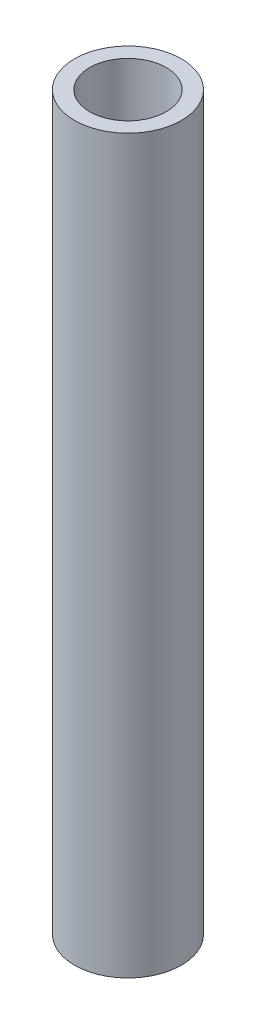
ISO-10303-21;
HEADER;
FILE_DESCRIPTION(('STEP AP214'),'2;1');
FILE_NAME('part.step','',(''),(''),'','','');
FILE_SCHEMA(('AUTOMOTIVE_DESIGN { 1 0 10303 214 1 1 1 1 }'));
ENDSEC;
DATA;
#1=APPLICATION_CONTEXT('core data for automotive mechanical design processes');
#2=APPLICATION_PROTOCOL_DEFINITION('international standard','automotive_design',2000,#1);
#3=PRODUCT_CONTEXT('',#1,'mechanical');
#4=PRODUCT('Part','Part','',(#3));
#5=PRODUCT_RELATED_PRODUCT_CATEGORY('part','',(#4));
#6=PRODUCT_DEFINITION_FORMATION('','',#4);
#7=PRODUCT_DEFINITION_CONTEXT('part definition',#1,'design');
#8=PRODUCT_DEFINITION('design','',#6,#7);
#9=PRODUCT_DEFINITION_SHAPE('','',#8);
#10=(LENGTH_UNIT() NAMED_UNIT(*) SI_UNIT(.MILLI.,.METRE.));
#11=(NAMED_UNIT(*) PLANE_ANGLE_UNIT() SI_UNIT($,.RADIAN.));
#12=(NAMED_UNIT(*) SI_UNIT($,.STERADIAN.) SOLID_ANGLE_UNIT());
#13=UNCERTAINTY_MEASURE_WITH_UNIT(LENGTH_MEASURE(1.E-05),#10,'distance_accuracy_value','');
#14=(GEOMETRIC_REPRESENTATION_CONTEXT(3) GLOBAL_UNCERTAINTY_ASSIGNED_CONTEXT((#13)) GLOBAL_UNIT_ASSIGNED_CONTEXT((#10,
#11,#12)) REPRESENTATION_CONTEXT('',''));
#15=CARTESIAN_POINT('',(0.,0.,0.));
#16=DIRECTION('',(0.,0.,1.));
#17=DIRECTION('',(1.,0.,0.));
#18=AXIS2_PLACEMENT_3D('',#15,#16,#17);
#19=CARTESIAN_POINT('',(0.,146.05,0.));
#20=DIRECTION('',(0.,1.,0.));
#21=DIRECTION('',(0.,0.,1.));
#22=AXIS2_PLACEMENT_3D('',#19,#20,#21);
#23=PLANE('',#22);
#24=CARTESIAN_POINT('',(0.,146.05,0.));
#25=DIRECTION('',(0.,1.,0.));
#26=DIRECTION('',(0.,0.,1.));
#27=AXIS2_PLACEMENT_3D('',#24,#25,#26);
#28=CIRCLE('',#27,10.668);
#29=CARTESIAN_POINT('',(0.,146.05,10.668));
#30=VERTEX_POINT('',#29);
#31=EDGE_CURVE('E10',#30,#30,#28,.T.);
#32=ORIENTED_EDGE('',*,*,#31,.T.);
#33=EDGE_LOOP('',(#32));
#34=FACE_BOUND('',#33,.T.);
#35=CARTESIAN_POINT('',(0.,146.05,0.));
#36=DIRECTION('',(0.,1.,0.));
#37=DIRECTION('',(0.,0.,1.));
#38=AXIS2_PLACEMENT_3D('',#35,#36,#37);
#39=CIRCLE('',#38,7.6454);
#40=CARTESIAN_POINT('',(0.,146.05,7.6454));
#41=VERTEX_POINT('',#40);
#42=EDGE_CURVE('E42',#41,#41,#39,.T.);
#43=ORIENTED_EDGE('',*,*,#42,.F.);
#44=EDGE_LOOP('',(#43));
#45=FACE_BOUND('',#44,.T.);
#46=ADVANCED_FACE('F31',(#34,#45),#23,.T.);
#47=CARTESIAN_POINT('',(0.,0.,0.));
#48=DIRECTION('',(0.,1.,0.));
#49=DIRECTION('',(0.,0.,1.));
#50=AXIS2_PLACEMENT_3D('',#47,#48,#49);
#51=PLANE('',#50);
#52=CARTESIAN_POINT('',(0.,0.,0.));
#53=DIRECTION('',(0.,1.,0.));
#54=DIRECTION('',(0.,0.,1.));
#55=AXIS2_PLACEMENT_3D('',#52,#53,#54);
#56=CIRCLE('',#55,10.668);
#57=CARTESIAN_POINT('',(0.,0.,10.668));
#58=VERTEX_POINT('',#57);
#59=EDGE_CURVE('E35',#58,#58,#56,.T.);
#60=ORIENTED_EDGE('',*,*,#59,.F.);
#61=EDGE_LOOP('',(#60));
#62=FACE_BOUND('',#61,.T.);
#63=CARTESIAN_POINT('',(0.,0.,0.));
#64=DIRECTION('',(0.,1.,0.));
#65=DIRECTION('',(0.,0.,1.));
#66=AXIS2_PLACEMENT_3D('',#63,#64,#65);
#67=CIRCLE('',#66,7.6454);
#68=CARTESIAN_POINT('',(0.,0.,7.6454));
#69=VERTEX_POINT('',#68);
#70=EDGE_CURVE('E44',#69,#69,#67,.T.);
#71=ORIENTED_EDGE('',*,*,#70,.T.);
#72=EDGE_LOOP('',(#71));
#73=FACE_BOUND('',#72,.T.);
#74=ADVANCED_FACE('F54',(#62,#73),#51,.F.);
#75=CARTESIAN_POINT('',(0.,146.05,0.));
#76=DIRECTION('',(0.,-1.,0.));
#77=DIRECTION('',(0.,0.,-1.));
#78=AXIS2_PLACEMENT_3D('',#75,#76,#77);
#79=CYLINDRICAL_SURFACE('',#78,10.668);
#80=ORIENTED_EDGE('',*,*,#31,.F.);
#81=EDGE_LOOP('',(#80));
#82=FACE_BOUND('',#81,.T.);
#83=ORIENTED_EDGE('',*,*,#59,.T.);
#84=EDGE_LOOP('',(#83));
#85=FACE_BOUND('',#84,.T.);
#86=ADVANCED_FACE('F33',(#82,#85),#79,.T.);
#87=CARTESIAN_POINT('',(0.,146.05,0.));
#88=DIRECTION('',(0.,-1.,0.));
#89=DIRECTION('',(0.,0.,-1.));
#90=AXIS2_PLACEMENT_3D('',#87,#88,#89);
#91=CYLINDRICAL_SURFACE('',#90,7.6454);
#92=ORIENTED_EDGE('',*,*,#42,.T.);
#93=EDGE_LOOP('',(#92));
#94=FACE_BOUND('',#93,.T.);
#95=ORIENTED_EDGE('',*,*,#70,.F.);
#96=EDGE_LOOP('',(#95));
#97=FACE_BOUND('',#96,.T.);
#98=ADVANCED_FACE('F50',(#94,#97),#91,.F.);
#99=CLOSED_SHELL('',(#46,#74,#86,#98));
#100=MANIFOLD_SOLID_BREP('B2',#99);
#101=ADVANCED_BREP_SHAPE_REPRESENTATION('',(#18,#100),#14);
#102=SHAPE_DEFINITION_REPRESENTATION(#9,#101);
ENDSEC;
END-ISO-10303-21;
